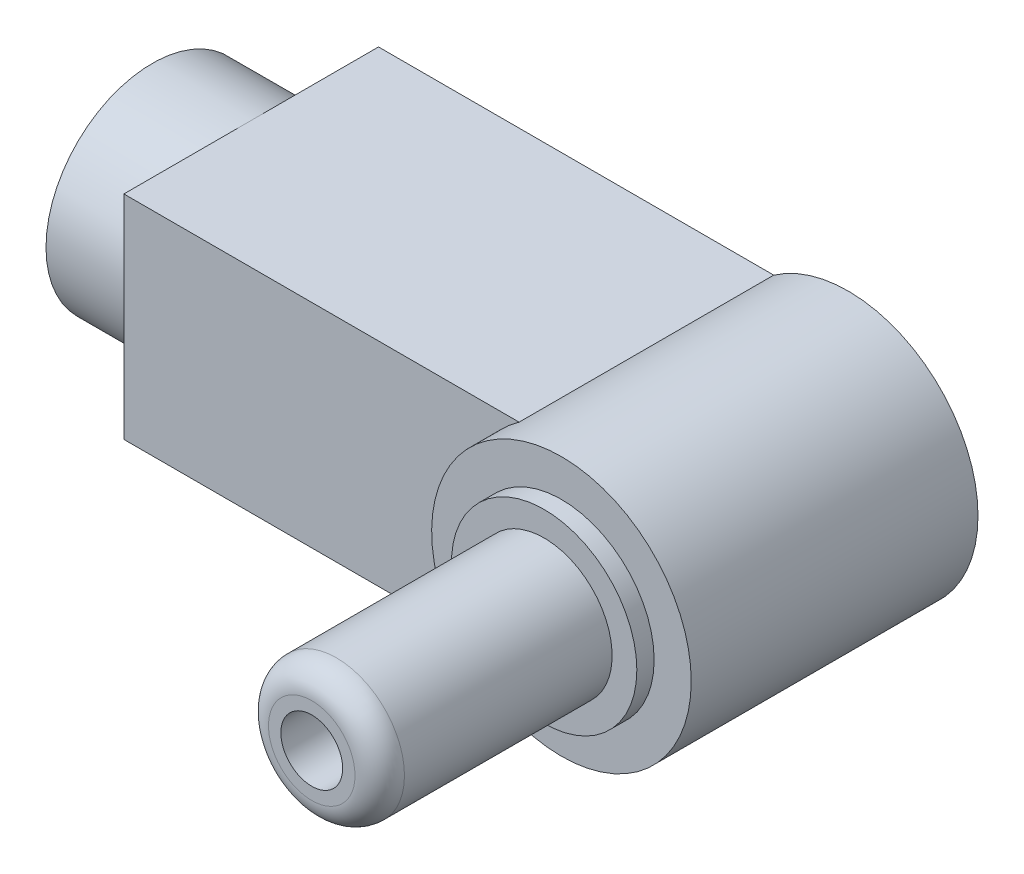
ISO-10303-21;
HEADER;
FILE_DESCRIPTION(('STEP AP214'),'2;1');
FILE_NAME('part.step','',(''),(''),'','','');
FILE_SCHEMA(('AUTOMOTIVE_DESIGN { 1 0 10303 214 1 1 1 1 }'));
ENDSEC;
DATA;
#1=APPLICATION_CONTEXT('core data for automotive mechanical design processes');
#2=APPLICATION_PROTOCOL_DEFINITION('international standard','automotive_design',2000,#1);
#3=PRODUCT_CONTEXT('',#1,'mechanical');
#4=PRODUCT('Part','Part','',(#3));
#5=PRODUCT_RELATED_PRODUCT_CATEGORY('part','',(#4));
#6=PRODUCT_DEFINITION_FORMATION('','',#4);
#7=PRODUCT_DEFINITION_CONTEXT('part definition',#1,'design');
#8=PRODUCT_DEFINITION('design','',#6,#7);
#9=PRODUCT_DEFINITION_SHAPE('','',#8);
#10=(LENGTH_UNIT() NAMED_UNIT(*) SI_UNIT(.MILLI.,.METRE.));
#11=(NAMED_UNIT(*) PLANE_ANGLE_UNIT() SI_UNIT($,.RADIAN.));
#12=(NAMED_UNIT(*) SI_UNIT($,.STERADIAN.) SOLID_ANGLE_UNIT());
#13=UNCERTAINTY_MEASURE_WITH_UNIT(LENGTH_MEASURE(1.E-05),#10,'distance_accuracy_value','');
#14=(GEOMETRIC_REPRESENTATION_CONTEXT(3) GLOBAL_UNCERTAINTY_ASSIGNED_CONTEXT((#13)) GLOBAL_UNIT_ASSIGNED_CONTEXT((#10,
#11,#12)) REPRESENTATION_CONTEXT('',''));
#15=CARTESIAN_POINT('',(0.,0.,0.));
#16=DIRECTION('',(0.,0.,1.));
#17=DIRECTION('',(1.,0.,0.));
#18=AXIS2_PLACEMENT_3D('',#15,#16,#17);
#19=CARTESIAN_POINT('',(-19.,4.3,10.3));
#20=DIRECTION('',(1.,0.,0.));
#21=DIRECTION('',(0.,0.,-1.));
#22=AXIS2_PLACEMENT_3D('',#19,#20,#21);
#23=PLANE('',#22);
#24=CARTESIAN_POINT('',(-19.,0.,5.15));
#25=DIRECTION('',(-1.,0.,0.));
#26=DIRECTION('',(0.,0.,1.));
#27=AXIS2_PLACEMENT_3D('',#24,#25,#26);
#28=CIRCLE('',#27,4.3);
#29=CARTESIAN_POINT('',(-19.,4.3,5.15));
#30=VERTEX_POINT('',#29);
#31=CARTESIAN_POINT('',(-19.,-4.3,5.15));
#32=VERTEX_POINT('',#31);
#33=EDGE_CURVE('E44',#30,#32,#28,.T.);
#34=ORIENTED_EDGE('',*,*,#33,.F.);
#35=DIRECTION('',(0.,0.,-1.));
#36=VECTOR('',#35,1.);
#37=CARTESIAN_POINT('',(-19.,4.3,10.3));
#38=LINE('',#37,#36);
#39=CARTESIAN_POINT('',(-19.,4.3,0.));
#40=VERTEX_POINT('',#39);
#41=EDGE_CURVE('E94',#30,#40,#38,.T.);
#42=ORIENTED_EDGE('',*,*,#41,.T.);
#43=DIRECTION('',(0.,-1.,0.));
#44=VECTOR('',#43,1.);
#45=CARTESIAN_POINT('',(-19.,4.3,0.));
#46=LINE('',#45,#44);
#47=CARTESIAN_POINT('',(-19.,-4.3,0.));
#48=VERTEX_POINT('',#47);
#49=EDGE_CURVE('E268',#40,#48,#46,.T.);
#50=ORIENTED_EDGE('',*,*,#49,.T.);
#51=DIRECTION('',(0.,0.,-1.));
#52=VECTOR('',#51,1.);
#53=CARTESIAN_POINT('',(-19.,-4.3,10.3));
#54=LINE('',#53,#52);
#55=EDGE_CURVE('E106',#32,#48,#54,.T.);
#56=ORIENTED_EDGE('',*,*,#55,.F.);
#57=EDGE_LOOP('',(#34,#42,#50,#56));
#58=FACE_BOUND('',#57,.T.);
#59=ADVANCED_FACE('F34',(#58),#23,.F.);
#60=EDGE_CURVE('E11',#32,#30,#28,.T.);
#61=ORIENTED_EDGE('',*,*,#60,.F.);
#62=CARTESIAN_POINT('',(-19.,-4.3,10.3));
#63=VERTEX_POINT('',#62);
#64=EDGE_CURVE('E104',#63,#32,#54,.T.);
#65=ORIENTED_EDGE('',*,*,#64,.F.);
#66=DIRECTION('',(0.,-1.,0.));
#67=VECTOR('',#66,1.);
#68=CARTESIAN_POINT('',(-19.,4.3,10.3));
#69=LINE('',#68,#67);
#70=CARTESIAN_POINT('',(-19.,4.3,10.3));
#71=VERTEX_POINT('',#70);
#72=EDGE_CURVE('E91',#71,#63,#69,.T.);
#73=ORIENTED_EDGE('',*,*,#72,.F.);
#74=EDGE_CURVE('E88',#71,#30,#38,.T.);
#75=ORIENTED_EDGE('',*,*,#74,.T.);
#76=EDGE_LOOP('',(#61,#65,#73,#75));
#77=FACE_BOUND('',#76,.T.);
#78=ADVANCED_FACE('F90',(#77),#23,.F.);
#79=CARTESIAN_POINT('',(0.,0.,12.3));
#80=DIRECTION('',(0.,0.,1.));
#81=DIRECTION('',(1.,0.,0.));
#82=AXIS2_PLACEMENT_3D('',#79,#80,#81);
#83=PLANE('',#82);
#84=CARTESIAN_POINT('',(0.,0.,12.3));
#85=DIRECTION('',(0.,0.,1.));
#86=DIRECTION('',(1.,0.,0.));
#87=AXIS2_PLACEMENT_3D('',#84,#85,#86);
#88=CIRCLE('',#87,3.75);
#89=CARTESIAN_POINT('',(3.75,0.,12.3));
#90=VERTEX_POINT('',#89);
#91=EDGE_CURVE('E157',#90,#90,#88,.T.);
#92=ORIENTED_EDGE('',*,*,#91,.T.);
#93=EDGE_LOOP('',(#92));
#94=FACE_BOUND('',#93,.T.);
#95=CARTESIAN_POINT('',(0.,0.,12.3));
#96=DIRECTION('',(0.,0.,1.));
#97=DIRECTION('',(1.,0.,0.));
#98=AXIS2_PLACEMENT_3D('',#95,#96,#97);
#99=CIRCLE('',#98,2.75);
#100=CARTESIAN_POINT('',(-2.75,0.,12.3));
#101=VERTEX_POINT('',#100);
#102=EDGE_CURVE('E153',#101,#101,#99,.T.);
#103=ORIENTED_EDGE('',*,*,#102,.F.);
#104=EDGE_LOOP('',(#103));
#105=FACE_BOUND('',#104,.T.);
#106=ADVANCED_FACE('F133',(#94,#105),#83,.T.);
#107=CARTESIAN_POINT('',(0.,0.,11.6));
#108=DIRECTION('',(0.,0.,1.));
#109=DIRECTION('',(1.,0.,0.));
#110=AXIS2_PLACEMENT_3D('',#107,#108,#109);
#111=PLANE('',#110);
#112=CARTESIAN_POINT('',(0.,0.,11.6));
#113=DIRECTION('',(0.,0.,1.));
#114=DIRECTION('',(1.,0.,0.));
#115=AXIS2_PLACEMENT_3D('',#112,#113,#114);
#116=CIRCLE('',#115,5.25);
#117=CARTESIAN_POINT('',(5.25,0.,11.6));
#118=VERTEX_POINT('',#117);
#119=EDGE_CURVE('E163',#118,#118,#116,.T.);
#120=ORIENTED_EDGE('',*,*,#119,.T.);
#121=EDGE_LOOP('',(#120));
#122=FACE_BOUND('',#121,.T.);
#123=CARTESIAN_POINT('',(0.,0.,11.6));
#124=DIRECTION('',(0.,0.,1.));
#125=DIRECTION('',(1.,0.,0.));
#126=AXIS2_PLACEMENT_3D('',#123,#124,#125);
#127=CIRCLE('',#126,3.75);
#128=CARTESIAN_POINT('',(3.75,0.,11.6));
#129=VERTEX_POINT('',#128);
#130=EDGE_CURVE('E156',#129,#129,#127,.T.);
#131=ORIENTED_EDGE('',*,*,#130,.F.);
#132=EDGE_LOOP('',(#131));
#133=FACE_BOUND('',#132,.T.);
#134=ADVANCED_FACE('F216',(#122,#133),#111,.T.);
#135=CARTESIAN_POINT('',(0.,0.,10.3));
#136=DIRECTION('',(0.,0.,-1.));
#137=DIRECTION('',(-1.,0.,0.));
#138=AXIS2_PLACEMENT_3D('',#135,#136,#137);
#139=PLANE('',#138);
#140=CARTESIAN_POINT('',(0.,0.,10.3));
#141=DIRECTION('',(0.,0.,1.));
#142=DIRECTION('',(1.,0.,0.));
#143=AXIS2_PLACEMENT_3D('',#140,#141,#142);
#144=CIRCLE('',#143,5.25);
#145=CARTESIAN_POINT('',(-3.01205909636581,4.3,10.3));
#146=VERTEX_POINT('',#145);
#147=CARTESIAN_POINT('',(-3.01205909636581,-4.3,10.3));
#148=VERTEX_POINT('',#147);
#149=EDGE_CURVE('E160',#146,#148,#144,.T.);
#150=ORIENTED_EDGE('',*,*,#149,.F.);
#151=DIRECTION('',(-1.,0.,0.));
#152=VECTOR('',#151,1.);
#153=CARTESIAN_POINT('',(-3.01205909636581,4.3,10.3));
#154=LINE('',#153,#152);
#155=EDGE_CURVE('E81',#146,#71,#154,.T.);
#156=ORIENTED_EDGE('',*,*,#155,.T.);
#157=ORIENTED_EDGE('',*,*,#72,.T.);
#158=DIRECTION('',(1.,0.,0.));
#159=VECTOR('',#158,1.);
#160=CARTESIAN_POINT('',(-19.,-4.3,10.3));
#161=LINE('',#160,#159);
#162=EDGE_CURVE('E58',#63,#148,#161,.T.);
#163=ORIENTED_EDGE('',*,*,#162,.T.);
#164=EDGE_LOOP('',(#150,#156,#157,#163));
#165=FACE_BOUND('',#164,.T.);
#166=ADVANCED_FACE('F221',(#165),#139,.F.);
#167=CARTESIAN_POINT('',(0.,0.,10.3));
#168=DIRECTION('',(0.,0.,-1.));
#169=DIRECTION('',(-1.,0.,0.));
#170=AXIS2_PLACEMENT_3D('',#167,#168,#169);
#171=CYLINDRICAL_SURFACE('',#170,5.25);
#172=CARTESIAN_POINT('',(0.,0.,0.));
#173=DIRECTION('',(0.,0.,1.));
#174=DIRECTION('',(-1.,0.,0.));
#175=AXIS2_PLACEMENT_3D('',#172,#173,#174);
#176=CIRCLE('',#175,5.25);
#177=CARTESIAN_POINT('',(-3.01205909636581,-4.3,0.));
#178=VERTEX_POINT('',#177);
#179=CARTESIAN_POINT('',(-3.01205909636581,4.3,0.));
#180=VERTEX_POINT('',#179);
#181=EDGE_CURVE('E166',#178,#180,#176,.T.);
#182=ORIENTED_EDGE('',*,*,#181,.T.);
#183=DIRECTION('',(0.,0.,-1.));
#184=VECTOR('',#183,1.);
#185=CARTESIAN_POINT('',(-3.01205909636581,4.3,10.3));
#186=LINE('',#185,#184);
#187=EDGE_CURVE('E93',#146,#180,#186,.T.);
#188=ORIENTED_EDGE('',*,*,#187,.F.);
#189=ORIENTED_EDGE('',*,*,#149,.T.);
#190=DIRECTION('',(0.,0.,-1.));
#191=VECTOR('',#190,1.);
#192=CARTESIAN_POINT('',(-3.01205909636581,-4.3,10.3));
#193=LINE('',#192,#191);
#194=EDGE_CURVE('E182',#148,#178,#193,.T.);
#195=ORIENTED_EDGE('',*,*,#194,.T.);
#196=EDGE_LOOP('',(#182,#188,#189,#195));
#197=FACE_BOUND('',#196,.T.);
#198=ORIENTED_EDGE('',*,*,#119,.F.);
#199=EDGE_LOOP('',(#198));
#200=FACE_BOUND('',#199,.T.);
#201=ADVANCED_FACE('F251',(#197,#200),#171,.T.);
#202=CARTESIAN_POINT('',(-3.01205909636581,4.3,10.3));
#203=DIRECTION('',(0.,-1.,0.));
#204=DIRECTION('',(0.,0.,-1.));
#205=AXIS2_PLACEMENT_3D('',#202,#203,#204);
#206=PLANE('',#205);
#207=DIRECTION('',(-1.,0.,0.));
#208=VECTOR('',#207,1.);
#209=CARTESIAN_POINT('',(-3.01205909636581,4.3,0.));
#210=LINE('',#209,#208);
#211=EDGE_CURVE('E100',#180,#40,#210,.T.);
#212=ORIENTED_EDGE('',*,*,#211,.T.);
#213=ORIENTED_EDGE('',*,*,#41,.F.);
#214=ORIENTED_EDGE('',*,*,#74,.F.);
#215=ORIENTED_EDGE('',*,*,#155,.F.);
#216=ORIENTED_EDGE('',*,*,#187,.T.);
#217=EDGE_LOOP('',(#212,#213,#214,#215,#216));
#218=FACE_BOUND('',#217,.T.);
#219=ADVANCED_FACE('F98',(#218),#206,.F.);
#220=CARTESIAN_POINT('',(-19.,-4.3,10.3));
#221=DIRECTION('',(0.,1.,0.));
#222=DIRECTION('',(0.,0.,1.));
#223=AXIS2_PLACEMENT_3D('',#220,#221,#222);
#224=PLANE('',#223);
#225=DIRECTION('',(1.,0.,0.));
#226=VECTOR('',#225,1.);
#227=CARTESIAN_POINT('',(-19.,-4.3,0.));
#228=LINE('',#227,#226);
#229=EDGE_CURVE('E77',#48,#178,#228,.T.);
#230=ORIENTED_EDGE('',*,*,#229,.T.);
#231=ORIENTED_EDGE('',*,*,#194,.F.);
#232=ORIENTED_EDGE('',*,*,#162,.F.);
#233=ORIENTED_EDGE('',*,*,#64,.T.);
#234=ORIENTED_EDGE('',*,*,#55,.T.);
#235=EDGE_LOOP('',(#230,#231,#232,#233,#234));
#236=FACE_BOUND('',#235,.T.);
#237=ADVANCED_FACE('F245',(#236),#224,.F.);
#238=CARTESIAN_POINT('',(0.,0.,0.));
#239=DIRECTION('',(0.,0.,-1.));
#240=DIRECTION('',(-1.,0.,0.));
#241=AXIS2_PLACEMENT_3D('',#238,#239,#240);
#242=PLANE('',#241);
#243=ORIENTED_EDGE('',*,*,#181,.F.);
#244=ORIENTED_EDGE('',*,*,#229,.F.);
#245=ORIENTED_EDGE('',*,*,#49,.F.);
#246=ORIENTED_EDGE('',*,*,#211,.F.);
#247=EDGE_LOOP('',(#243,#244,#245,#246));
#248=FACE_BOUND('',#247,.T.);
#249=ADVANCED_FACE('F237',(#248),#242,.T.);
#250=CARTESIAN_POINT('',(0.,0.,12.3));
#251=DIRECTION('',(0.,0.,-1.));
#252=DIRECTION('',(-1.,0.,0.));
#253=AXIS2_PLACEMENT_3D('',#250,#251,#252);
#254=CYLINDRICAL_SURFACE('',#253,3.75);
#255=ORIENTED_EDGE('',*,*,#91,.F.);
#256=EDGE_LOOP('',(#255));
#257=FACE_BOUND('',#256,.T.);
#258=ORIENTED_EDGE('',*,*,#130,.T.);
#259=EDGE_LOOP('',(#258));
#260=FACE_BOUND('',#259,.T.);
#261=ADVANCED_FACE('F232',(#257,#260),#254,.T.);
#262=CARTESIAN_POINT('',(0.,0.,21.7));
#263=DIRECTION('',(0.,0.,1.));
#264=DIRECTION('',(1.,0.,0.));
#265=AXIS2_PLACEMENT_3D('',#262,#263,#264);
#266=PLANE('',#265);
#267=CARTESIAN_POINT('',(0.,0.,21.7));
#268=DIRECTION('',(0.,0.,1.));
#269=DIRECTION('',(1.,0.,0.));
#270=AXIS2_PLACEMENT_3D('',#267,#268,#269);
#271=CIRCLE('',#270,1.75);
#272=CARTESIAN_POINT('',(1.75,0.,21.7));
#273=VERTEX_POINT('',#272);
#274=EDGE_CURVE('E189',#273,#273,#271,.T.);
#275=ORIENTED_EDGE('',*,*,#274,.T.);
#276=EDGE_LOOP('',(#275));
#277=FACE_BOUND('',#276,.T.);
#278=CARTESIAN_POINT('',(0.,0.,21.7));
#279=DIRECTION('',(0.,0.,1.));
#280=DIRECTION('',(1.,0.,0.));
#281=AXIS2_PLACEMENT_3D('',#278,#279,#280);
#282=CIRCLE('',#281,1.25);
#283=CARTESIAN_POINT('',(-1.25,0.,21.7));
#284=VERTEX_POINT('',#283);
#285=EDGE_CURVE('E149',#284,#284,#282,.T.);
#286=ORIENTED_EDGE('',*,*,#285,.F.);
#287=EDGE_LOOP('',(#286));
#288=FACE_BOUND('',#287,.T.);
#289=ADVANCED_FACE('F228',(#277,#288),#266,.T.);
#290=CARTESIAN_POINT('',(0.,0.,21.7));
#291=DIRECTION('',(0.,0.,-1.));
#292=DIRECTION('',(-1.,0.,0.));
#293=AXIS2_PLACEMENT_3D('',#290,#291,#292);
#294=CYLINDRICAL_SURFACE('',#293,2.75);
#295=CARTESIAN_POINT('',(0.,0.,20.7));
#296=DIRECTION('',(0.,0.,1.));
#297=DIRECTION('',(1.,0.,0.));
#298=AXIS2_PLACEMENT_3D('',#295,#296,#297);
#299=CIRCLE('',#298,2.75);
#300=CARTESIAN_POINT('',(-2.75,0.,20.7));
#301=VERTEX_POINT('',#300);
#302=EDGE_CURVE('E38',#301,#301,#299,.F.);
#303=CARTESIAN_POINT('',(-2.75,0.,20.7));
#304=CARTESIAN_POINT('',(-2.75,0.,20.6125));
#305=CARTESIAN_POINT('',(-2.75,0.,20.525));
#306=CARTESIAN_POINT('',(-2.75,0.,20.35));
#307=CARTESIAN_POINT('',(-2.75,0.,20.2625));
#308=CARTESIAN_POINT('',(-2.75,0.,20.0875));
#309=CARTESIAN_POINT('',(-2.75,0.,20.));
#310=CARTESIAN_POINT('',(-2.75,0.,19.825));
#311=CARTESIAN_POINT('',(-2.75,0.,19.7375));
#312=CARTESIAN_POINT('',(-2.75,0.,19.5625));
#313=CARTESIAN_POINT('',(-2.75,0.,19.475));
#314=CARTESIAN_POINT('',(-2.75,0.,19.3));
#315=CARTESIAN_POINT('',(-2.75,0.,19.2125));
#316=CARTESIAN_POINT('',(-2.75,0.,19.0375));
#317=CARTESIAN_POINT('',(-2.75,0.,18.95));
#318=CARTESIAN_POINT('',(-2.75,0.,18.775));
#319=CARTESIAN_POINT('',(-2.75,0.,18.6875));
#320=CARTESIAN_POINT('',(-2.75,0.,18.5125));
#321=CARTESIAN_POINT('',(-2.75,0.,18.425));
#322=CARTESIAN_POINT('',(-2.75,0.,18.25));
#323=CARTESIAN_POINT('',(-2.75,0.,18.1625));
#324=CARTESIAN_POINT('',(-2.75,0.,17.9875));
#325=CARTESIAN_POINT('',(-2.75,0.,17.9));
#326=CARTESIAN_POINT('',(-2.75,0.,17.725));
#327=CARTESIAN_POINT('',(-2.75,0.,17.6375));
#328=CARTESIAN_POINT('',(-2.75,0.,17.4625));
#329=CARTESIAN_POINT('',(-2.75,0.,17.375));
#330=CARTESIAN_POINT('',(-2.75,0.,17.2));
#331=CARTESIAN_POINT('',(-2.75,0.,17.1125));
#332=CARTESIAN_POINT('',(-2.75,0.,16.9375));
#333=CARTESIAN_POINT('',(-2.75,0.,16.85));
#334=CARTESIAN_POINT('',(-2.75,0.,16.675));
#335=CARTESIAN_POINT('',(-2.75,0.,16.5875));
#336=CARTESIAN_POINT('',(-2.75,0.,16.4125));
#337=CARTESIAN_POINT('',(-2.75,0.,16.325));
#338=CARTESIAN_POINT('',(-2.75,0.,16.15));
#339=CARTESIAN_POINT('',(-2.75,0.,16.0625));
#340=CARTESIAN_POINT('',(-2.75,0.,15.8875));
#341=CARTESIAN_POINT('',(-2.75,0.,15.8));
#342=CARTESIAN_POINT('',(-2.75,0.,15.625));
#343=CARTESIAN_POINT('',(-2.75,0.,15.5375));
#344=CARTESIAN_POINT('',(-2.75,0.,15.3625));
#345=CARTESIAN_POINT('',(-2.75,0.,15.275));
#346=CARTESIAN_POINT('',(-2.75,0.,15.1));
#347=CARTESIAN_POINT('',(-2.75,0.,15.0125));
#348=CARTESIAN_POINT('',(-2.75,0.,14.8375));
#349=CARTESIAN_POINT('',(-2.75,0.,14.75));
#350=CARTESIAN_POINT('',(-2.75,0.,14.575));
#351=CARTESIAN_POINT('',(-2.75,0.,14.4875));
#352=CARTESIAN_POINT('',(-2.75,0.,14.3125));
#353=CARTESIAN_POINT('',(-2.75,0.,14.225));
#354=CARTESIAN_POINT('',(-2.75,0.,14.05));
#355=CARTESIAN_POINT('',(-2.75,0.,13.9625));
#356=CARTESIAN_POINT('',(-2.75,0.,13.7875));
#357=CARTESIAN_POINT('',(-2.75,0.,13.7));
#358=CARTESIAN_POINT('',(-2.75,0.,13.525));
#359=CARTESIAN_POINT('',(-2.75,0.,13.4375));
#360=CARTESIAN_POINT('',(-2.75,0.,13.2625));
#361=CARTESIAN_POINT('',(-2.75,0.,13.175));
#362=CARTESIAN_POINT('',(-2.75,0.,13.));
#363=CARTESIAN_POINT('',(-2.75,0.,12.9125));
#364=CARTESIAN_POINT('',(-2.75,0.,12.7375));
#365=CARTESIAN_POINT('',(-2.75,0.,12.65));
#366=CARTESIAN_POINT('',(-2.75,0.,12.475));
#367=CARTESIAN_POINT('',(-2.75,0.,12.3875));
#368=CARTESIAN_POINT('',(-2.75,0.,12.3));
#369=B_SPLINE_CURVE_WITH_KNOTS('',3,(#303,#304,#305,#306,#307,#308,#309,#310,#311,#312,#313,
#314,#315,#316,#317,#318,#319,#320,#321,#322,#323,#324,#325,#326,#327,#328,#329,#330,#331,#332,
#333,#334,#335,#336,#337,#338,#339,#340,#341,#342,#343,#344,#345,#346,#347,#348,#349,#350,#351,
#352,#353,#354,#355,#356,#357,#358,#359,#360,#361,#362,#363,#364,#365,#366,#367,#368),
.UNSPECIFIED.,.F.,.F.,(4,2,2,2,2,2,2,2,2,2,2,2,2,2,2,2,2,2,2,2,2,2,2,2,2,2,2,2,2,2,2,2,4),(0.,
0.262499999999999,0.524999999999998,0.7875,1.05,1.3125,1.575,1.8375,2.1,2.3625,2.625,2.8875,
3.15,3.4125,3.675,3.9375,4.2,4.4625,4.725,4.9875,5.25,5.5125,5.775,6.0375,6.3,6.5625,6.825,
7.0875,7.35,7.6125,7.875,8.1375,8.4),.UNSPECIFIED.);
#370=EDGE_CURVE('BSEAM196',#301,#101,#369,.T.);
#371=ORIENTED_EDGE('',*,*,#302,.T.);
#372=ORIENTED_EDGE('',*,*,#102,.T.);
#373=ORIENTED_EDGE('',*,*,#370,.T.);
#374=ORIENTED_EDGE('',*,*,#370,.F.);
#375=EDGE_LOOP('',(#371,#373,#372,#374));
#376=FACE_BOUND('',#375,.T.);
#377=ADVANCED_FACE('F196',(#376),#294,.T.);
#378=CARTESIAN_POINT('',(0.,0.,21.7));
#379=DIRECTION('',(0.,0.,-1.));
#380=DIRECTION('',(-1.,0.,0.));
#381=AXIS2_PLACEMENT_3D('',#378,#379,#380);
#382=CYLINDRICAL_SURFACE('',#381,1.25);
#383=CARTESIAN_POINT('',(0.,0.,12.3));
#384=DIRECTION('',(0.,0.,1.));
#385=DIRECTION('',(1.,0.,0.));
#386=AXIS2_PLACEMENT_3D('',#383,#384,#385);
#387=CIRCLE('',#386,1.25);
#388=CARTESIAN_POINT('',(-1.25,0.,12.3));
#389=VERTEX_POINT('',#388);
#390=EDGE_CURVE('E175',#389,#389,#387,.F.);
#391=CARTESIAN_POINT('',(-1.25,0.,21.7));
#392=CARTESIAN_POINT('',(-1.25,0.,21.6020833333333));
#393=CARTESIAN_POINT('',(-1.25,0.,21.5041666666667));
#394=CARTESIAN_POINT('',(-1.25,0.,21.3083333333333));
#395=CARTESIAN_POINT('',(-1.25,0.,21.2104166666667));
#396=CARTESIAN_POINT('',(-1.25,0.,21.0145833333333));
#397=CARTESIAN_POINT('',(-1.25,0.,20.9166666666667));
#398=CARTESIAN_POINT('',(-1.25,0.,20.7208333333333));
#399=CARTESIAN_POINT('',(-1.25,0.,20.6229166666667));
#400=CARTESIAN_POINT('',(-1.25,0.,20.4270833333333));
#401=CARTESIAN_POINT('',(-1.25,0.,20.3291666666667));
#402=CARTESIAN_POINT('',(-1.25,0.,20.1333333333333));
#403=CARTESIAN_POINT('',(-1.25,0.,20.0354166666667));
#404=CARTESIAN_POINT('',(-1.25,0.,19.8395833333333));
#405=CARTESIAN_POINT('',(-1.25,0.,19.7416666666667));
#406=CARTESIAN_POINT('',(-1.25,0.,19.5458333333333));
#407=CARTESIAN_POINT('',(-1.25,0.,19.4479166666667));
#408=CARTESIAN_POINT('',(-1.25,0.,19.2520833333333));
#409=CARTESIAN_POINT('',(-1.25,0.,19.1541666666667));
#410=CARTESIAN_POINT('',(-1.25,0.,18.9583333333333));
#411=CARTESIAN_POINT('',(-1.25,0.,18.8604166666667));
#412=CARTESIAN_POINT('',(-1.25,0.,18.6645833333333));
#413=CARTESIAN_POINT('',(-1.25,0.,18.5666666666667));
#414=CARTESIAN_POINT('',(-1.25,0.,18.3708333333333));
#415=CARTESIAN_POINT('',(-1.25,0.,18.2729166666667));
#416=CARTESIAN_POINT('',(-1.25,0.,18.0770833333333));
#417=CARTESIAN_POINT('',(-1.25,0.,17.9791666666667));
#418=CARTESIAN_POINT('',(-1.25,0.,17.7833333333333));
#419=CARTESIAN_POINT('',(-1.25,0.,17.6854166666667));
#420=CARTESIAN_POINT('',(-1.25,0.,17.4895833333333));
#421=CARTESIAN_POINT('',(-1.25,0.,17.3916666666667));
#422=CARTESIAN_POINT('',(-1.25,0.,17.1958333333333));
#423=CARTESIAN_POINT('',(-1.25,0.,17.0979166666667));
#424=CARTESIAN_POINT('',(-1.25,0.,16.9020833333333));
#425=CARTESIAN_POINT('',(-1.25,0.,16.8041666666667));
#426=CARTESIAN_POINT('',(-1.25,0.,16.6083333333333));
#427=CARTESIAN_POINT('',(-1.25,0.,16.5104166666667));
#428=CARTESIAN_POINT('',(-1.25,0.,16.3145833333333));
#429=CARTESIAN_POINT('',(-1.25,0.,16.2166666666667));
#430=CARTESIAN_POINT('',(-1.25,0.,16.0208333333333));
#431=CARTESIAN_POINT('',(-1.25,0.,15.9229166666667));
#432=CARTESIAN_POINT('',(-1.25,0.,15.7270833333333));
#433=CARTESIAN_POINT('',(-1.25,0.,15.6291666666667));
#434=CARTESIAN_POINT('',(-1.25,0.,15.4333333333333));
#435=CARTESIAN_POINT('',(-1.25,0.,15.3354166666667));
#436=CARTESIAN_POINT('',(-1.25,0.,15.1395833333333));
#437=CARTESIAN_POINT('',(-1.25,0.,15.0416666666667));
#438=CARTESIAN_POINT('',(-1.25,0.,14.8458333333333));
#439=CARTESIAN_POINT('',(-1.25,0.,14.7479166666667));
#440=CARTESIAN_POINT('',(-1.25,0.,14.5520833333333));
#441=CARTESIAN_POINT('',(-1.25,0.,14.4541666666667));
#442=CARTESIAN_POINT('',(-1.25,0.,14.2583333333333));
#443=CARTESIAN_POINT('',(-1.25,0.,14.1604166666667));
#444=CARTESIAN_POINT('',(-1.25,0.,13.9645833333333));
#445=CARTESIAN_POINT('',(-1.25,0.,13.8666666666667));
#446=CARTESIAN_POINT('',(-1.25,0.,13.6708333333333));
#447=CARTESIAN_POINT('',(-1.25,0.,13.5729166666667));
#448=CARTESIAN_POINT('',(-1.25,0.,13.3770833333333));
#449=CARTESIAN_POINT('',(-1.25,0.,13.2791666666667));
#450=CARTESIAN_POINT('',(-1.25,0.,13.0833333333333));
#451=CARTESIAN_POINT('',(-1.25,0.,12.9854166666667));
#452=CARTESIAN_POINT('',(-1.25,0.,12.7895833333333));
#453=CARTESIAN_POINT('',(-1.25,0.,12.6916666666667));
#454=CARTESIAN_POINT('',(-1.25,0.,12.4958333333333));
#455=CARTESIAN_POINT('',(-1.25,0.,12.3979166666667));
#456=CARTESIAN_POINT('',(-1.25,0.,12.3));
#457=B_SPLINE_CURVE_WITH_KNOTS('',3,(#391,#392,#393,#394,#395,#396,#397,#398,#399,#400,#401,
#402,#403,#404,#405,#406,#407,#408,#409,#410,#411,#412,#413,#414,#415,#416,#417,#418,#419,#420,
#421,#422,#423,#424,#425,#426,#427,#428,#429,#430,#431,#432,#433,#434,#435,#436,#437,#438,#439,
#440,#441,#442,#443,#444,#445,#446,#447,#448,#449,#450,#451,#452,#453,#454,#455,#456),
.UNSPECIFIED.,.F.,.F.,(4,2,2,2,2,2,2,2,2,2,2,2,2,2,2,2,2,2,2,2,2,2,2,2,2,2,2,2,2,2,2,2,4),(0.,
0.293749999999999,0.587499999999998,0.881249999999997,1.175,1.46875,1.7625,2.05625,2.35,2.64375,
2.9375,3.23125,3.525,3.81875,4.1125,4.40625,4.7,4.99375,5.2875,5.58125,5.875,6.16875,6.4625,
6.75625,7.05,7.34375,7.6375,7.93125,8.225,8.51875,8.8125,9.10625,9.4),.UNSPECIFIED.);
#458=EDGE_CURVE('BSEAM205',#284,#389,#457,.T.);
#459=ORIENTED_EDGE('',*,*,#285,.T.);
#460=ORIENTED_EDGE('',*,*,#390,.T.);
#461=ORIENTED_EDGE('',*,*,#458,.T.);
#462=ORIENTED_EDGE('',*,*,#458,.F.);
#463=EDGE_LOOP('',(#459,#461,#460,#462));
#464=FACE_BOUND('',#463,.T.);
#465=ADVANCED_FACE('F205',(#464),#382,.F.);
#466=ORIENTED_EDGE('',*,*,#390,.F.);
#467=EDGE_LOOP('',(#466));
#468=FACE_BOUND('',#467,.T.);
#469=ADVANCED_FACE('F201',(#468),#83,.T.);
#470=CARTESIAN_POINT('',(0.,0.,20.7));
#471=DIRECTION('',(0.,0.,1.));
#472=DIRECTION('',(1.,0.,0.));
#473=AXIS2_PLACEMENT_3D('',#470,#471,#472);
#474=TOROIDAL_SURFACE('',#473,1.75,1.);
#475=ORIENTED_EDGE('',*,*,#302,.F.);
#476=EDGE_LOOP('',(#475));
#477=FACE_BOUND('',#476,.T.);
#478=ORIENTED_EDGE('',*,*,#274,.F.);
#479=EDGE_LOOP('',(#478));
#480=FACE_BOUND('',#479,.T.);
#481=ADVANCED_FACE('F36',(#477,#480),#474,.T.);
#482=CARTESIAN_POINT('',(-23.,0.,5.15));
#483=DIRECTION('',(-1.,0.,0.));
#484=DIRECTION('',(0.,0.,1.));
#485=AXIS2_PLACEMENT_3D('',#482,#483,#484);
#486=PLANE('',#485);
#487=CARTESIAN_POINT('',(-23.,0.,5.15));
#488=DIRECTION('',(-1.,0.,0.));
#489=DIRECTION('',(0.,0.,1.));
#490=AXIS2_PLACEMENT_3D('',#487,#488,#489);
#491=CIRCLE('',#490,4.3);
#492=CARTESIAN_POINT('',(-23.,0.,9.45));
#493=VERTEX_POINT('',#492);
#494=EDGE_CURVE('E109',#493,#493,#491,.T.);
#495=ORIENTED_EDGE('',*,*,#494,.T.);
#496=EDGE_LOOP('',(#495));
#497=FACE_BOUND('',#496,.T.);
#498=CARTESIAN_POINT('',(-23.,0.,5.15));
#499=DIRECTION('',(-1.,0.,0.));
#500=DIRECTION('',(0.,0.,1.));
#501=AXIS2_PLACEMENT_3D('',#498,#499,#500);
#502=CIRCLE('',#501,2.75);
#503=CARTESIAN_POINT('',(-23.,0.,7.9));
#504=VERTEX_POINT('',#503);
#505=EDGE_CURVE('E110',#504,#504,#502,.T.);
#506=ORIENTED_EDGE('',*,*,#505,.F.);
#507=EDGE_LOOP('',(#506));
#508=FACE_BOUND('',#507,.T.);
#509=ADVANCED_FACE('F114',(#497,#508),#486,.T.);
#510=CARTESIAN_POINT('',(-23.,0.,5.15));
#511=DIRECTION('',(1.,0.,0.));
#512=DIRECTION('',(0.,0.,-1.));
#513=AXIS2_PLACEMENT_3D('',#510,#511,#512);
#514=CYLINDRICAL_SURFACE('',#513,4.3);
#515=ORIENTED_EDGE('',*,*,#494,.F.);
#516=EDGE_LOOP('',(#515));
#517=FACE_BOUND('',#516,.T.);
#518=ORIENTED_EDGE('',*,*,#33,.T.);
#519=ORIENTED_EDGE('',*,*,#60,.T.);
#520=EDGE_LOOP('',(#518,#519));
#521=FACE_BOUND('',#520,.T.);
#522=ADVANCED_FACE('F111',(#517,#521),#514,.T.);
#523=CARTESIAN_POINT('',(-23.,0.,5.15));
#524=DIRECTION('',(1.,0.,0.));
#525=DIRECTION('',(0.,0.,-1.));
#526=AXIS2_PLACEMENT_3D('',#523,#524,#525);
#527=CYLINDRICAL_SURFACE('',#526,2.75);
#528=ORIENTED_EDGE('',*,*,#505,.T.);
#529=EDGE_LOOP('',(#528));
#530=FACE_BOUND('',#529,.T.);
#531=CARTESIAN_POINT('',(-19.,0.,5.15));
#532=DIRECTION('',(-1.,0.,0.));
#533=DIRECTION('',(0.,0.,1.));
#534=AXIS2_PLACEMENT_3D('',#531,#532,#533);
#535=CIRCLE('',#534,2.75);
#536=CARTESIAN_POINT('',(-19.,0.,7.9));
#537=VERTEX_POINT('',#536);
#538=EDGE_CURVE('E142',#537,#537,#535,.T.);
#539=ORIENTED_EDGE('',*,*,#538,.F.);
#540=EDGE_LOOP('',(#539));
#541=FACE_BOUND('',#540,.T.);
#542=ADVANCED_FACE('F113',(#530,#541),#527,.F.);
#543=ORIENTED_EDGE('',*,*,#538,.T.);
#544=EDGE_LOOP('',(#543));
#545=FACE_BOUND('',#544,.T.);
#546=ADVANCED_FACE('F121',(#545),#23,.F.);
#547=CLOSED_SHELL('',(#59,#78,#106,#134,#166,#201,#219,#237,#249,#261,#289,#377,#465,#469,#481,
#509,#522,#542,#546));
#548=MANIFOLD_SOLID_BREP('B2',#547);
#549=ADVANCED_BREP_SHAPE_REPRESENTATION('',(#18,#548),#14);
#550=SHAPE_DEFINITION_REPRESENTATION(#9,#549);
ENDSEC;
END-ISO-10303-21;
